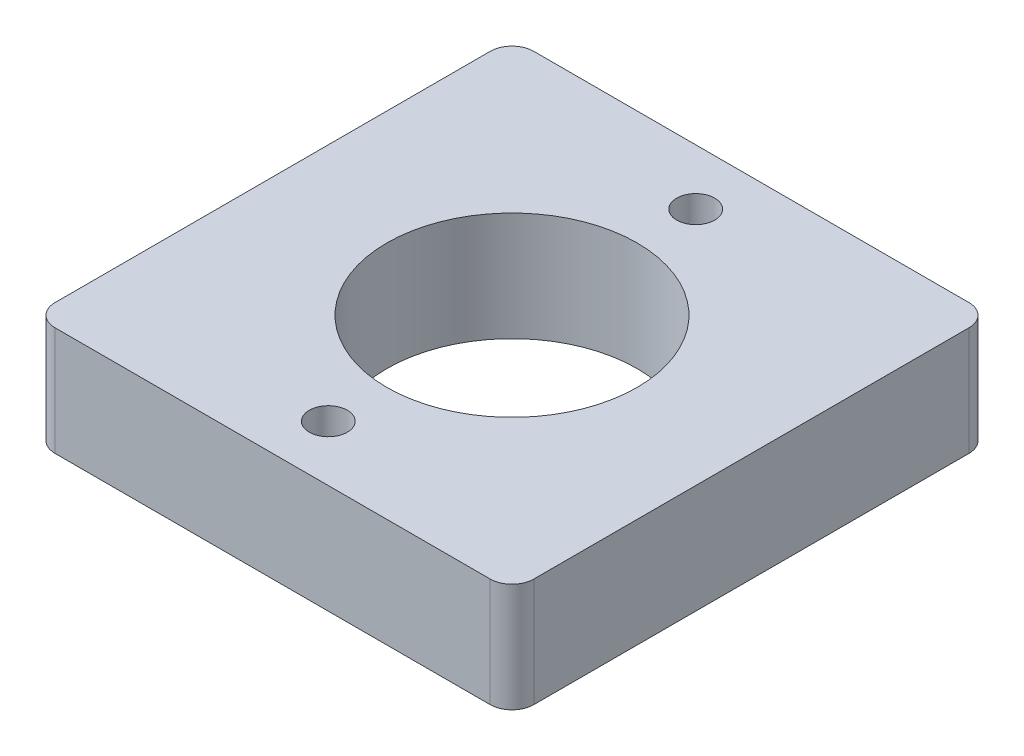
ISO-10303-21;
HEADER;
FILE_DESCRIPTION(('STEP AP214'),'2;1');
FILE_NAME('part.step','',(''),(''),'','','');
FILE_SCHEMA(('AUTOMOTIVE_DESIGN { 1 0 10303 214 1 1 1 1 }'));
ENDSEC;
DATA;
#1=APPLICATION_CONTEXT('core data for automotive mechanical design processes');
#2=APPLICATION_PROTOCOL_DEFINITION('international standard','automotive_design',2000,#1);
#3=PRODUCT_CONTEXT('',#1,'mechanical');
#4=PRODUCT('Part','Part','',(#3));
#5=PRODUCT_RELATED_PRODUCT_CATEGORY('part','',(#4));
#6=PRODUCT_DEFINITION_FORMATION('','',#4);
#7=PRODUCT_DEFINITION_CONTEXT('part definition',#1,'design');
#8=PRODUCT_DEFINITION('design','',#6,#7);
#9=PRODUCT_DEFINITION_SHAPE('','',#8);
#10=(LENGTH_UNIT() NAMED_UNIT(*) SI_UNIT(.MILLI.,.METRE.));
#11=(NAMED_UNIT(*) PLANE_ANGLE_UNIT() SI_UNIT($,.RADIAN.));
#12=(NAMED_UNIT(*) SI_UNIT($,.STERADIAN.) SOLID_ANGLE_UNIT());
#13=UNCERTAINTY_MEASURE_WITH_UNIT(LENGTH_MEASURE(1.E-05),#10,'distance_accuracy_value','');
#14=(GEOMETRIC_REPRESENTATION_CONTEXT(3) GLOBAL_UNCERTAINTY_ASSIGNED_CONTEXT((#13)) GLOBAL_UNIT_ASSIGNED_CONTEXT((#10,
#11,#12)) REPRESENTATION_CONTEXT('',''));
#15=CARTESIAN_POINT('',(0.,0.,0.));
#16=DIRECTION('',(0.,0.,1.));
#17=DIRECTION('',(1.,0.,0.));
#18=AXIS2_PLACEMENT_3D('',#15,#16,#17);
#19=CARTESIAN_POINT('',(0.,10.,0.));
#20=DIRECTION('',(0.,-1.,0.));
#21=DIRECTION('',(0.,0.,-1.));
#22=AXIS2_PLACEMENT_3D('',#19,#20,#21);
#23=PLANE('',#22);
#24=CARTESIAN_POINT('',(0.,10.,-16.88));
#25=DIRECTION('',(0.,1.,0.));
#26=DIRECTION('',(0.,0.,1.));
#27=AXIS2_PLACEMENT_3D('',#24,#25,#26);
#28=CIRCLE('',#27,1.75);
#29=CARTESIAN_POINT('',(0.,10.,-15.13));
#30=VERTEX_POINT('',#29);
#31=EDGE_CURVE('E223',#30,#30,#28,.T.);
#32=ORIENTED_EDGE('',*,*,#31,.F.);
#33=EDGE_LOOP('',(#32));
#34=FACE_BOUND('',#33,.T.);
#35=CARTESIAN_POINT('',(0.,10.,16.88));
#36=DIRECTION('',(0.,1.,0.));
#37=DIRECTION('',(0.,0.,1.));
#38=AXIS2_PLACEMENT_3D('',#35,#36,#37);
#39=CIRCLE('',#38,1.75);
#40=CARTESIAN_POINT('',(0.,10.,18.63));
#41=VERTEX_POINT('',#40);
#42=EDGE_CURVE('E215',#41,#41,#39,.T.);
#43=ORIENTED_EDGE('',*,*,#42,.F.);
#44=EDGE_LOOP('',(#43));
#45=FACE_BOUND('',#44,.T.);
#46=DIRECTION('',(0.,0.,-1.));
#47=VECTOR('',#46,1.);
#48=CARTESIAN_POINT('',(22.,10.,22.));
#49=LINE('',#48,#47);
#50=CARTESIAN_POINT('',(22.,10.,20.));
#51=VERTEX_POINT('',#50);
#52=CARTESIAN_POINT('',(22.,10.,-20.));
#53=VERTEX_POINT('',#52);
#54=EDGE_CURVE('E150',#51,#53,#49,.T.);
#55=ORIENTED_EDGE('',*,*,#54,.T.);
#56=CARTESIAN_POINT('',(20.,10.,-20.));
#57=DIRECTION('',(0.,-1.,0.));
#58=DIRECTION('',(0.,0.,-1.));
#59=AXIS2_PLACEMENT_3D('',#56,#57,#58);
#60=CIRCLE('',#59,2.);
#61=CARTESIAN_POINT('',(20.,10.,-22.));
#62=VERTEX_POINT('',#61);
#63=EDGE_CURVE('E174',#53,#62,#60,.F.);
#64=ORIENTED_EDGE('',*,*,#63,.T.);
#65=DIRECTION('',(-1.,0.,0.));
#66=VECTOR('',#65,1.);
#67=CARTESIAN_POINT('',(-22.,10.,-22.));
#68=LINE('',#67,#66);
#69=CARTESIAN_POINT('',(-20.,10.,-22.));
#70=VERTEX_POINT('',#69);
#71=EDGE_CURVE('E127',#62,#70,#68,.T.);
#72=ORIENTED_EDGE('',*,*,#71,.T.);
#73=CARTESIAN_POINT('',(-20.,10.,-20.));
#74=DIRECTION('',(0.,-1.,0.));
#75=DIRECTION('',(0.,0.,-1.));
#76=AXIS2_PLACEMENT_3D('',#73,#74,#75);
#77=CIRCLE('',#76,2.);
#78=CARTESIAN_POINT('',(-22.,10.,-20.));
#79=VERTEX_POINT('',#78);
#80=EDGE_CURVE('E166',#70,#79,#77,.F.);
#81=ORIENTED_EDGE('',*,*,#80,.T.);
#82=DIRECTION('',(0.,0.,1.));
#83=VECTOR('',#82,1.);
#84=CARTESIAN_POINT('',(-22.,10.,22.));
#85=LINE('',#84,#83);
#86=CARTESIAN_POINT('',(-22.,10.,20.));
#87=VERTEX_POINT('',#86);
#88=EDGE_CURVE('E189',#79,#87,#85,.T.);
#89=ORIENTED_EDGE('',*,*,#88,.T.);
#90=CARTESIAN_POINT('',(-20.,10.,20.));
#91=DIRECTION('',(0.,-1.,0.));
#92=DIRECTION('',(0.,0.,-1.));
#93=AXIS2_PLACEMENT_3D('',#90,#91,#92);
#94=CIRCLE('',#93,2.);
#95=CARTESIAN_POINT('',(-20.,10.,22.));
#96=VERTEX_POINT('',#95);
#97=EDGE_CURVE('E62',#87,#96,#94,.F.);
#98=ORIENTED_EDGE('',*,*,#97,.T.);
#99=DIRECTION('',(1.,0.,0.));
#100=VECTOR('',#99,1.);
#101=CARTESIAN_POINT('',(-22.,10.,22.));
#102=LINE('',#101,#100);
#103=CARTESIAN_POINT('',(20.,10.,22.));
#104=VERTEX_POINT('',#103);
#105=EDGE_CURVE('E152',#96,#104,#102,.T.);
#106=ORIENTED_EDGE('',*,*,#105,.T.);
#107=CARTESIAN_POINT('',(20.,10.,20.));
#108=DIRECTION('',(0.,-1.,0.));
#109=DIRECTION('',(0.,0.,-1.));
#110=AXIS2_PLACEMENT_3D('',#107,#108,#109);
#111=CIRCLE('',#110,2.);
#112=EDGE_CURVE('E171',#104,#51,#111,.F.);
#113=ORIENTED_EDGE('',*,*,#112,.T.);
#114=EDGE_LOOP('',(#55,#64,#72,#81,#89,#98,#106,#113));
#115=FACE_BOUND('',#114,.T.);
#116=CARTESIAN_POINT('',(0.,10.,0.));
#117=DIRECTION('',(0.,1.,0.));
#118=DIRECTION('',(0.,0.,1.));
#119=AXIS2_PLACEMENT_3D('',#116,#117,#118);
#120=CIRCLE('',#119,11.5);
#121=CARTESIAN_POINT('',(0.,10.,11.5));
#122=VERTEX_POINT('',#121);
#123=EDGE_CURVE('E144',#122,#122,#120,.T.);
#124=ORIENTED_EDGE('',*,*,#123,.F.);
#125=EDGE_LOOP('',(#124));
#126=FACE_BOUND('',#125,.T.);
#127=ADVANCED_FACE('F39',(#34,#45,#115,#126),#23,.F.);
#128=CARTESIAN_POINT('',(0.,0.,0.));
#129=DIRECTION('',(0.,-1.,0.));
#130=DIRECTION('',(0.,0.,-1.));
#131=AXIS2_PLACEMENT_3D('',#128,#129,#130);
#132=PLANE('',#131);
#133=CARTESIAN_POINT('',(0.,0.,-16.88));
#134=DIRECTION('',(0.,1.,0.));
#135=DIRECTION('',(0.,0.,1.));
#136=AXIS2_PLACEMENT_3D('',#133,#134,#135);
#137=CIRCLE('',#136,1.75);
#138=CARTESIAN_POINT('',(0.,0.,-15.13));
#139=VERTEX_POINT('',#138);
#140=EDGE_CURVE('E211',#139,#139,#137,.T.);
#141=ORIENTED_EDGE('',*,*,#140,.T.);
#142=EDGE_LOOP('',(#141));
#143=FACE_BOUND('',#142,.T.);
#144=CARTESIAN_POINT('',(0.,0.,16.88));
#145=DIRECTION('',(0.,1.,0.));
#146=DIRECTION('',(0.,0.,1.));
#147=AXIS2_PLACEMENT_3D('',#144,#145,#146);
#148=CIRCLE('',#147,1.75);
#149=CARTESIAN_POINT('',(0.,0.,18.63));
#150=VERTEX_POINT('',#149);
#151=EDGE_CURVE('E219',#150,#150,#148,.T.);
#152=ORIENTED_EDGE('',*,*,#151,.T.);
#153=EDGE_LOOP('',(#152));
#154=FACE_BOUND('',#153,.T.);
#155=DIRECTION('',(-1.,0.,0.));
#156=VECTOR('',#155,1.);
#157=CARTESIAN_POINT('',(-22.,0.,-22.));
#158=LINE('',#157,#156);
#159=CARTESIAN_POINT('',(20.,0.,-22.));
#160=VERTEX_POINT('',#159);
#161=CARTESIAN_POINT('',(-20.,0.,-22.));
#162=VERTEX_POINT('',#161);
#163=EDGE_CURVE('E124',#160,#162,#158,.T.);
#164=ORIENTED_EDGE('',*,*,#163,.F.);
#165=CARTESIAN_POINT('',(20.,0.,-20.));
#166=DIRECTION('',(0.,-1.,0.));
#167=DIRECTION('',(0.,0.,-1.));
#168=AXIS2_PLACEMENT_3D('',#165,#166,#167);
#169=CIRCLE('',#168,2.);
#170=CARTESIAN_POINT('',(22.,0.,-20.));
#171=VERTEX_POINT('',#170);
#172=EDGE_CURVE('E106',#160,#171,#169,.T.);
#173=ORIENTED_EDGE('',*,*,#172,.T.);
#174=DIRECTION('',(0.,0.,-1.));
#175=VECTOR('',#174,1.);
#176=CARTESIAN_POINT('',(22.,0.,22.));
#177=LINE('',#176,#175);
#178=CARTESIAN_POINT('',(22.,0.,20.));
#179=VERTEX_POINT('',#178);
#180=EDGE_CURVE('E137',#179,#171,#177,.T.);
#181=ORIENTED_EDGE('',*,*,#180,.F.);
#182=CARTESIAN_POINT('',(20.,0.,20.));
#183=DIRECTION('',(0.,-1.,0.));
#184=DIRECTION('',(0.,0.,-1.));
#185=AXIS2_PLACEMENT_3D('',#182,#183,#184);
#186=CIRCLE('',#185,2.);
#187=CARTESIAN_POINT('',(20.,0.,22.));
#188=VERTEX_POINT('',#187);
#189=EDGE_CURVE('E118',#179,#188,#186,.T.);
#190=ORIENTED_EDGE('',*,*,#189,.T.);
#191=DIRECTION('',(1.,0.,0.));
#192=VECTOR('',#191,1.);
#193=CARTESIAN_POINT('',(-22.,0.,22.));
#194=LINE('',#193,#192);
#195=CARTESIAN_POINT('',(-20.,0.,22.));
#196=VERTEX_POINT('',#195);
#197=EDGE_CURVE('E142',#196,#188,#194,.T.);
#198=ORIENTED_EDGE('',*,*,#197,.F.);
#199=CARTESIAN_POINT('',(-20.,0.,20.));
#200=DIRECTION('',(0.,-1.,0.));
#201=DIRECTION('',(0.,0.,-1.));
#202=AXIS2_PLACEMENT_3D('',#199,#200,#201);
#203=CIRCLE('',#202,2.);
#204=CARTESIAN_POINT('',(-22.,0.,20.));
#205=VERTEX_POINT('',#204);
#206=EDGE_CURVE('E156',#196,#205,#203,.T.);
#207=ORIENTED_EDGE('',*,*,#206,.T.);
#208=DIRECTION('',(0.,0.,1.));
#209=VECTOR('',#208,1.);
#210=CARTESIAN_POINT('',(-22.,0.,22.));
#211=LINE('',#210,#209);
#212=CARTESIAN_POINT('',(-22.,0.,-20.));
#213=VERTEX_POINT('',#212);
#214=EDGE_CURVE('E136',#213,#205,#211,.T.);
#215=ORIENTED_EDGE('',*,*,#214,.F.);
#216=CARTESIAN_POINT('',(-20.,0.,-20.));
#217=DIRECTION('',(0.,-1.,0.));
#218=DIRECTION('',(0.,0.,-1.));
#219=AXIS2_PLACEMENT_3D('',#216,#217,#218);
#220=CIRCLE('',#219,2.);
#221=EDGE_CURVE('E129',#213,#162,#220,.T.);
#222=ORIENTED_EDGE('',*,*,#221,.T.);
#223=EDGE_LOOP('',(#164,#173,#181,#190,#198,#207,#215,#222));
#224=FACE_BOUND('',#223,.T.);
#225=CARTESIAN_POINT('',(0.,0.,0.));
#226=DIRECTION('',(0.,1.,0.));
#227=DIRECTION('',(0.,0.,1.));
#228=AXIS2_PLACEMENT_3D('',#225,#226,#227);
#229=CIRCLE('',#228,11.5);
#230=CARTESIAN_POINT('',(0.,0.,11.5));
#231=VERTEX_POINT('',#230);
#232=EDGE_CURVE('E207',#231,#231,#229,.T.);
#233=ORIENTED_EDGE('',*,*,#232,.T.);
#234=EDGE_LOOP('',(#233));
#235=FACE_BOUND('',#234,.T.);
#236=ADVANCED_FACE('F132',(#143,#154,#224,#235),#132,.T.);
#237=CARTESIAN_POINT('',(22.,10.,22.));
#238=DIRECTION('',(-1.,0.,0.));
#239=DIRECTION('',(0.,0.,1.));
#240=AXIS2_PLACEMENT_3D('',#237,#238,#239);
#241=PLANE('',#240);
#242=ORIENTED_EDGE('',*,*,#180,.T.);
#243=DIRECTION('',(0.,-1.,0.));
#244=VECTOR('',#243,1.);
#245=CARTESIAN_POINT('',(22.,10.,-20.));
#246=LINE('',#245,#244);
#247=EDGE_CURVE('E111',#171,#53,#246,.F.);
#248=ORIENTED_EDGE('',*,*,#247,.T.);
#249=ORIENTED_EDGE('',*,*,#54,.F.);
#250=DIRECTION('',(0.,-1.,0.));
#251=VECTOR('',#250,1.);
#252=CARTESIAN_POINT('',(22.,10.,20.));
#253=LINE('',#252,#251);
#254=EDGE_CURVE('E117',#51,#179,#253,.T.);
#255=ORIENTED_EDGE('',*,*,#254,.T.);
#256=EDGE_LOOP('',(#242,#248,#249,#255));
#257=FACE_BOUND('',#256,.T.);
#258=ADVANCED_FACE('F254',(#257),#241,.F.);
#259=CARTESIAN_POINT('',(-22.,10.,-22.));
#260=DIRECTION('',(0.,0.,1.));
#261=DIRECTION('',(1.,0.,0.));
#262=AXIS2_PLACEMENT_3D('',#259,#260,#261);
#263=PLANE('',#262);
#264=ORIENTED_EDGE('',*,*,#71,.F.);
#265=DIRECTION('',(0.,-1.,0.));
#266=VECTOR('',#265,1.);
#267=CARTESIAN_POINT('',(20.,10.,-22.));
#268=LINE('',#267,#266);
#269=EDGE_CURVE('E110',#62,#160,#268,.T.);
#270=ORIENTED_EDGE('',*,*,#269,.T.);
#271=ORIENTED_EDGE('',*,*,#163,.T.);
#272=DIRECTION('',(0.,-1.,0.));
#273=VECTOR('',#272,1.);
#274=CARTESIAN_POINT('',(-20.,10.,-22.));
#275=LINE('',#274,#273);
#276=EDGE_CURVE('E130',#162,#70,#275,.F.);
#277=ORIENTED_EDGE('',*,*,#276,.T.);
#278=EDGE_LOOP('',(#264,#270,#271,#277));
#279=FACE_BOUND('',#278,.T.);
#280=ADVANCED_FACE('F123',(#279),#263,.F.);
#281=CARTESIAN_POINT('',(-22.,10.,22.));
#282=DIRECTION('',(1.,0.,0.));
#283=DIRECTION('',(0.,0.,-1.));
#284=AXIS2_PLACEMENT_3D('',#281,#282,#283);
#285=PLANE('',#284);
#286=ORIENTED_EDGE('',*,*,#214,.T.);
#287=DIRECTION('',(0.,-1.,0.));
#288=VECTOR('',#287,1.);
#289=CARTESIAN_POINT('',(-22.,10.,20.));
#290=LINE('',#289,#288);
#291=EDGE_CURVE('E11',#205,#87,#290,.F.);
#292=ORIENTED_EDGE('',*,*,#291,.T.);
#293=ORIENTED_EDGE('',*,*,#88,.F.);
#294=DIRECTION('',(0.,-1.,0.));
#295=VECTOR('',#294,1.);
#296=CARTESIAN_POINT('',(-22.,10.,-20.));
#297=LINE('',#296,#295);
#298=EDGE_CURVE('E48',#79,#213,#297,.T.);
#299=ORIENTED_EDGE('',*,*,#298,.T.);
#300=EDGE_LOOP('',(#286,#292,#293,#299));
#301=FACE_BOUND('',#300,.T.);
#302=ADVANCED_FACE('F187',(#301),#285,.F.);
#303=CARTESIAN_POINT('',(-22.,10.,22.));
#304=DIRECTION('',(0.,0.,-1.));
#305=DIRECTION('',(-1.,0.,0.));
#306=AXIS2_PLACEMENT_3D('',#303,#304,#305);
#307=PLANE('',#306);
#308=ORIENTED_EDGE('',*,*,#197,.T.);
#309=DIRECTION('',(0.,-1.,0.));
#310=VECTOR('',#309,1.);
#311=CARTESIAN_POINT('',(20.,10.,22.));
#312=LINE('',#311,#310);
#313=EDGE_CURVE('E55',#188,#104,#312,.F.);
#314=ORIENTED_EDGE('',*,*,#313,.T.);
#315=ORIENTED_EDGE('',*,*,#105,.F.);
#316=DIRECTION('',(0.,-1.,0.));
#317=VECTOR('',#316,1.);
#318=CARTESIAN_POINT('',(-20.,10.,22.));
#319=LINE('',#318,#317);
#320=EDGE_CURVE('E177',#96,#196,#319,.T.);
#321=ORIENTED_EDGE('',*,*,#320,.T.);
#322=EDGE_LOOP('',(#308,#314,#315,#321));
#323=FACE_BOUND('',#322,.T.);
#324=ADVANCED_FACE('F196',(#323),#307,.F.);
#325=CARTESIAN_POINT('',(0.,10.,0.));
#326=DIRECTION('',(0.,-1.,0.));
#327=DIRECTION('',(0.,0.,-1.));
#328=AXIS2_PLACEMENT_3D('',#325,#326,#327);
#329=CYLINDRICAL_SURFACE('',#328,11.5);
#330=ORIENTED_EDGE('',*,*,#123,.T.);
#331=EDGE_LOOP('',(#330));
#332=FACE_BOUND('',#331,.T.);
#333=ORIENTED_EDGE('',*,*,#232,.F.);
#334=EDGE_LOOP('',(#333));
#335=FACE_BOUND('',#334,.T.);
#336=ADVANCED_FACE('F248',(#332,#335),#329,.F.);
#337=CARTESIAN_POINT('',(0.,0.,16.88));
#338=DIRECTION('',(0.,1.,0.));
#339=DIRECTION('',(0.,0.,1.));
#340=AXIS2_PLACEMENT_3D('',#337,#338,#339);
#341=CYLINDRICAL_SURFACE('',#340,1.75);
#342=ORIENTED_EDGE('',*,*,#151,.F.);
#343=EDGE_LOOP('',(#342));
#344=FACE_BOUND('',#343,.T.);
#345=ORIENTED_EDGE('',*,*,#42,.T.);
#346=EDGE_LOOP('',(#345));
#347=FACE_BOUND('',#346,.T.);
#348=ADVANCED_FACE('F236',(#344,#347),#341,.F.);
#349=CARTESIAN_POINT('',(0.,0.,-16.88));
#350=DIRECTION('',(0.,1.,0.));
#351=DIRECTION('',(0.,0.,1.));
#352=AXIS2_PLACEMENT_3D('',#349,#350,#351);
#353=CYLINDRICAL_SURFACE('',#352,1.75);
#354=ORIENTED_EDGE('',*,*,#140,.F.);
#355=EDGE_LOOP('',(#354));
#356=FACE_BOUND('',#355,.T.);
#357=ORIENTED_EDGE('',*,*,#31,.T.);
#358=EDGE_LOOP('',(#357));
#359=FACE_BOUND('',#358,.T.);
#360=ADVANCED_FACE('F233',(#356,#359),#353,.F.);
#361=CARTESIAN_POINT('',(20.,10.,-20.));
#362=DIRECTION('',(0.,-1.,0.));
#363=DIRECTION('',(0.,0.,-1.));
#364=AXIS2_PLACEMENT_3D('',#361,#362,#363);
#365=CYLINDRICAL_SURFACE('',#364,2.);
#366=ORIENTED_EDGE('',*,*,#63,.F.);
#367=ORIENTED_EDGE('',*,*,#247,.F.);
#368=ORIENTED_EDGE('',*,*,#172,.F.);
#369=ORIENTED_EDGE('',*,*,#269,.F.);
#370=EDGE_LOOP('',(#366,#367,#368,#369));
#371=FACE_BOUND('',#370,.T.);
#372=ADVANCED_FACE('F109',(#371),#365,.T.);
#373=CARTESIAN_POINT('',(20.,10.,20.));
#374=DIRECTION('',(0.,-1.,0.));
#375=DIRECTION('',(0.,0.,-1.));
#376=AXIS2_PLACEMENT_3D('',#373,#374,#375);
#377=CYLINDRICAL_SURFACE('',#376,2.);
#378=ORIENTED_EDGE('',*,*,#112,.F.);
#379=ORIENTED_EDGE('',*,*,#313,.F.);
#380=ORIENTED_EDGE('',*,*,#189,.F.);
#381=ORIENTED_EDGE('',*,*,#254,.F.);
#382=EDGE_LOOP('',(#378,#379,#380,#381));
#383=FACE_BOUND('',#382,.T.);
#384=ADVANCED_FACE('F270',(#383),#377,.T.);
#385=CARTESIAN_POINT('',(-20.,10.,20.));
#386=DIRECTION('',(0.,-1.,0.));
#387=DIRECTION('',(0.,0.,-1.));
#388=AXIS2_PLACEMENT_3D('',#385,#386,#387);
#389=CYLINDRICAL_SURFACE('',#388,2.);
#390=ORIENTED_EDGE('',*,*,#97,.F.);
#391=ORIENTED_EDGE('',*,*,#291,.F.);
#392=ORIENTED_EDGE('',*,*,#206,.F.);
#393=ORIENTED_EDGE('',*,*,#320,.F.);
#394=EDGE_LOOP('',(#390,#391,#392,#393));
#395=FACE_BOUND('',#394,.T.);
#396=ADVANCED_FACE('F195',(#395),#389,.T.);
#397=CARTESIAN_POINT('',(-20.,10.,-20.));
#398=DIRECTION('',(0.,-1.,0.));
#399=DIRECTION('',(0.,0.,-1.));
#400=AXIS2_PLACEMENT_3D('',#397,#398,#399);
#401=CYLINDRICAL_SURFACE('',#400,2.);
#402=ORIENTED_EDGE('',*,*,#80,.F.);
#403=ORIENTED_EDGE('',*,*,#276,.F.);
#404=ORIENTED_EDGE('',*,*,#221,.F.);
#405=ORIENTED_EDGE('',*,*,#298,.F.);
#406=EDGE_LOOP('',(#402,#403,#404,#405));
#407=FACE_BOUND('',#406,.T.);
#408=ADVANCED_FACE('F41',(#407),#401,.T.);
#409=CLOSED_SHELL('',(#127,#236,#258,#280,#302,#324,#336,#348,#360,#372,#384,#396,#408));
#410=MANIFOLD_SOLID_BREP('B2',#409);
#411=ADVANCED_BREP_SHAPE_REPRESENTATION('',(#18,#410),#14);
#412=SHAPE_DEFINITION_REPRESENTATION(#9,#411);
ENDSEC;
END-ISO-10303-21;
